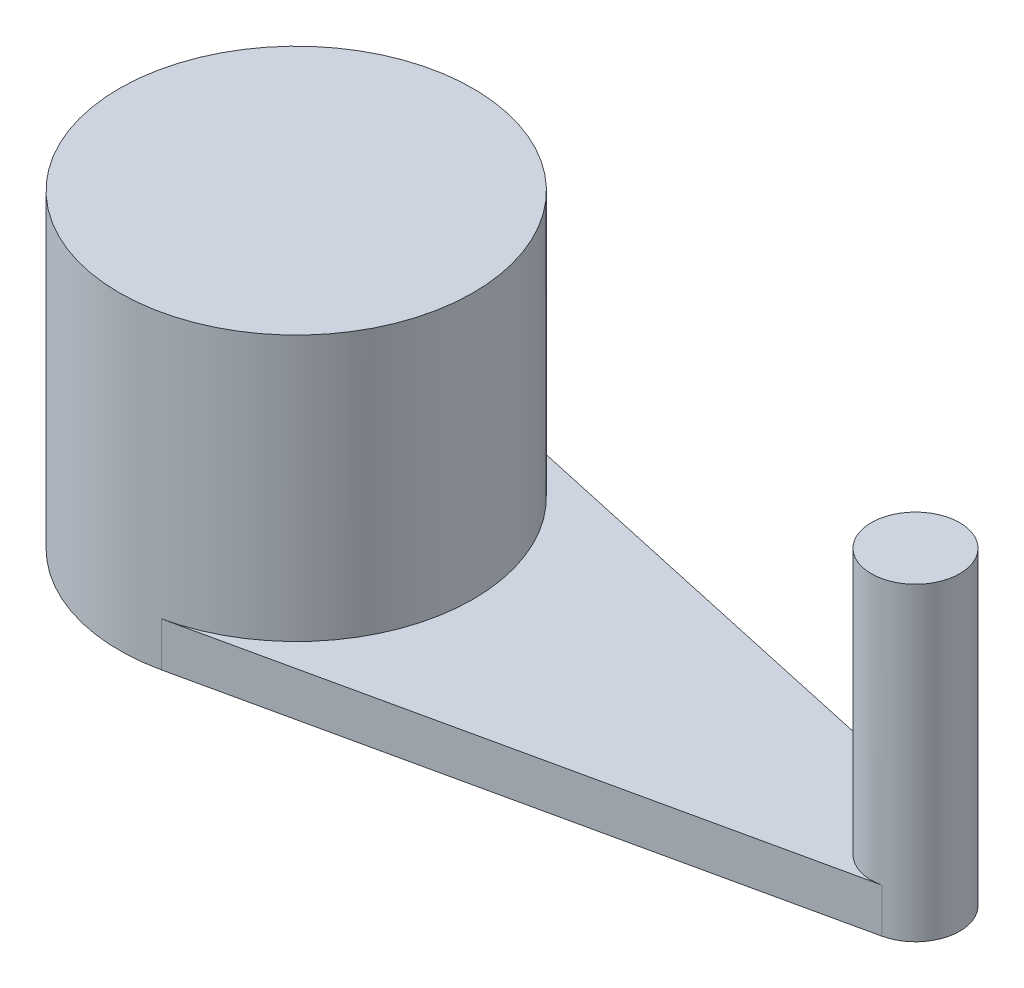
ISO-10303-21;
HEADER;
FILE_DESCRIPTION(('STEP AP214'),'2;1');
FILE_NAME('part.step','',(''),(''),'','','');
FILE_SCHEMA(('AUTOMOTIVE_DESIGN { 1 0 10303 214 1 1 1 1 }'));
ENDSEC;
DATA;
#1=APPLICATION_CONTEXT('core data for automotive mechanical design processes');
#2=APPLICATION_PROTOCOL_DEFINITION('international standard','automotive_design',2000,#1);
#3=PRODUCT_CONTEXT('',#1,'mechanical');
#4=PRODUCT('Part','Part','',(#3));
#5=PRODUCT_RELATED_PRODUCT_CATEGORY('part','',(#4));
#6=PRODUCT_DEFINITION_FORMATION('','',#4);
#7=PRODUCT_DEFINITION_CONTEXT('part definition',#1,'design');
#8=PRODUCT_DEFINITION('design','',#6,#7);
#9=PRODUCT_DEFINITION_SHAPE('','',#8);
#10=(LENGTH_UNIT() NAMED_UNIT(*) SI_UNIT(.MILLI.,.METRE.));
#11=(NAMED_UNIT(*) PLANE_ANGLE_UNIT() SI_UNIT($,.RADIAN.));
#12=(NAMED_UNIT(*) SI_UNIT($,.STERADIAN.) SOLID_ANGLE_UNIT());
#13=UNCERTAINTY_MEASURE_WITH_UNIT(LENGTH_MEASURE(1.E-05),#10,'distance_accuracy_value','');
#14=(GEOMETRIC_REPRESENTATION_CONTEXT(3) GLOBAL_UNCERTAINTY_ASSIGNED_CONTEXT((#13)) GLOBAL_UNIT_ASSIGNED_CONTEXT((#10,
#11,#12)) REPRESENTATION_CONTEXT('',''));
#15=CARTESIAN_POINT('',(0.,0.,0.));
#16=DIRECTION('',(0.,0.,1.));
#17=DIRECTION('',(1.,0.,0.));
#18=AXIS2_PLACEMENT_3D('',#15,#16,#17);
#19=CARTESIAN_POINT('',(4.28571428571428,5.,19.5354204731105));
#20=DIRECTION('',(-0.214285714285714,0.,-0.976771023655525));
#21=DIRECTION('',(-0.976771023655525,0.,0.214285714285714));
#22=AXIS2_PLACEMENT_3D('',#19,#20,#21);
#23=PLANE('',#22);
#24=DIRECTION('',(0.976771023655525,0.,-0.214285714285714));
#25=VECTOR('',#24,1.);
#26=CARTESIAN_POINT('',(4.28571428571428,0.,19.5354204731105));
#27=LINE('',#26,#25);
#28=CARTESIAN_POINT('',(4.28571428571428,0.,19.5354204731105));
#29=VERTEX_POINT('',#28);
#30=CARTESIAN_POINT('',(71.0714285714286,0.,4.88385511827763));
#31=VERTEX_POINT('',#30);
#32=EDGE_CURVE('E102',#29,#31,#27,.T.);
#33=ORIENTED_EDGE('',*,*,#32,.T.);
#34=DIRECTION('',(0.,-1.,0.));
#35=VECTOR('',#34,1.);
#36=CARTESIAN_POINT('',(71.0714285714286,5.,4.88385511827763));
#37=LINE('',#36,#35);
#38=CARTESIAN_POINT('',(71.0714285714286,5.,4.88385511827763));
#39=VERTEX_POINT('',#38);
#40=EDGE_CURVE('E52',#39,#31,#37,.T.);
#41=ORIENTED_EDGE('',*,*,#40,.F.);
#42=DIRECTION('',(0.976771023655525,0.,-0.214285714285714));
#43=VECTOR('',#42,1.);
#44=CARTESIAN_POINT('',(4.28571428571428,5.,19.5354204731105));
#45=LINE('',#44,#43);
#46=CARTESIAN_POINT('',(4.28571428571428,5.,19.5354204731105));
#47=VERTEX_POINT('',#46);
#48=EDGE_CURVE('E95',#47,#39,#45,.T.);
#49=ORIENTED_EDGE('',*,*,#48,.F.);
#50=DIRECTION('',(0.,-1.,0.));
#51=VECTOR('',#50,1.);
#52=CARTESIAN_POINT('',(4.28571428571428,5.,19.5354204731105));
#53=LINE('',#52,#51);
#54=EDGE_CURVE('E89',#47,#29,#53,.T.);
#55=ORIENTED_EDGE('',*,*,#54,.T.);
#56=EDGE_LOOP('',(#33,#41,#49,#55));
#57=FACE_BOUND('',#56,.T.);
#58=ADVANCED_FACE('F49',(#57),#23,.F.);
#59=CARTESIAN_POINT('',(70.,5.,0.));
#60=DIRECTION('',(0.,-1.,0.));
#61=DIRECTION('',(0.,0.,-1.));
#62=AXIS2_PLACEMENT_3D('',#59,#60,#61);
#63=CYLINDRICAL_SURFACE('',#62,5.);
#64=CARTESIAN_POINT('',(70.,0.,0.));
#65=DIRECTION('',(0.,1.,0.));
#66=DIRECTION('',(0.,0.,1.));
#67=AXIS2_PLACEMENT_3D('',#64,#65,#66);
#68=CIRCLE('',#67,5.);
#69=CARTESIAN_POINT('',(71.0714285714286,0.,-4.88385511827763));
#70=VERTEX_POINT('',#69);
#71=EDGE_CURVE('E109',#31,#70,#68,.T.);
#72=ORIENTED_EDGE('',*,*,#71,.T.);
#73=DIRECTION('',(0.,-1.,0.));
#74=VECTOR('',#73,1.);
#75=CARTESIAN_POINT('',(71.0714285714286,5.,-4.88385511827763));
#76=LINE('',#75,#74);
#77=CARTESIAN_POINT('',(71.0714285714286,5.,-4.88385511827763));
#78=VERTEX_POINT('',#77);
#79=EDGE_CURVE('E126',#78,#70,#76,.T.);
#80=ORIENTED_EDGE('',*,*,#79,.F.);
#81=CARTESIAN_POINT('',(70.,5.,0.));
#82=DIRECTION('',(0.,1.,0.));
#83=DIRECTION('',(0.,0.,1.));
#84=AXIS2_PLACEMENT_3D('',#81,#82,#83);
#85=CIRCLE('',#84,5.);
#86=EDGE_CURVE('E11',#78,#39,#85,.T.);
#87=ORIENTED_EDGE('',*,*,#86,.T.);
#88=ORIENTED_EDGE('',*,*,#40,.T.);
#89=EDGE_LOOP('',(#72,#80,#87,#88));
#90=FACE_BOUND('',#89,.T.);
#91=CARTESIAN_POINT('',(70.,35.,0.));
#92=DIRECTION('',(0.,1.,0.));
#93=DIRECTION('',(0.,0.,1.));
#94=AXIS2_PLACEMENT_3D('',#91,#92,#93);
#95=CIRCLE('',#94,5.);
#96=CARTESIAN_POINT('',(70.,35.,5.));
#97=VERTEX_POINT('',#96);
#98=EDGE_CURVE('E140',#97,#97,#95,.T.);
#99=ORIENTED_EDGE('',*,*,#98,.F.);
#100=EDGE_LOOP('',(#99));
#101=FACE_BOUND('',#100,.T.);
#102=ADVANCED_FACE('F131',(#90,#101),#63,.T.);
#103=CARTESIAN_POINT('',(4.28571428571428,5.,-19.5354204731105));
#104=DIRECTION('',(0.214285714285714,0.,-0.976771023655525));
#105=DIRECTION('',(-0.976771023655525,0.,-0.214285714285714));
#106=AXIS2_PLACEMENT_3D('',#103,#104,#105);
#107=PLANE('',#106);
#108=DIRECTION('',(0.976771023655525,0.,0.214285714285714));
#109=VECTOR('',#108,1.);
#110=CARTESIAN_POINT('',(4.28571428571428,0.,-19.5354204731105));
#111=LINE('',#110,#109);
#112=CARTESIAN_POINT('',(4.28571428571428,0.,-19.5354204731105));
#113=VERTEX_POINT('',#112);
#114=EDGE_CURVE('E96',#113,#70,#111,.T.);
#115=ORIENTED_EDGE('',*,*,#114,.F.);
#116=DIRECTION('',(0.,-1.,0.));
#117=VECTOR('',#116,1.);
#118=CARTESIAN_POINT('',(4.28571428571428,5.,-19.5354204731105));
#119=LINE('',#118,#117);
#120=CARTESIAN_POINT('',(4.28571428571428,5.,-19.5354204731105));
#121=VERTEX_POINT('',#120);
#122=EDGE_CURVE('E67',#121,#113,#119,.T.);
#123=ORIENTED_EDGE('',*,*,#122,.F.);
#124=DIRECTION('',(0.976771023655525,0.,0.214285714285714));
#125=VECTOR('',#124,1.);
#126=CARTESIAN_POINT('',(4.28571428571428,5.,-19.5354204731105));
#127=LINE('',#126,#125);
#128=EDGE_CURVE('E105',#121,#78,#127,.T.);
#129=ORIENTED_EDGE('',*,*,#128,.T.);
#130=ORIENTED_EDGE('',*,*,#79,.T.);
#131=EDGE_LOOP('',(#115,#123,#129,#130));
#132=FACE_BOUND('',#131,.T.);
#133=ADVANCED_FACE('F149',(#132),#107,.T.);
#134=CARTESIAN_POINT('',(0.,5.,0.));
#135=DIRECTION('',(0.,-1.,0.));
#136=DIRECTION('',(0.,0.,-1.));
#137=AXIS2_PLACEMENT_3D('',#134,#135,#136);
#138=CYLINDRICAL_SURFACE('',#137,20.);
#139=CARTESIAN_POINT('',(0.,0.,0.));
#140=DIRECTION('',(0.,1.,0.));
#141=DIRECTION('',(0.,0.,1.));
#142=AXIS2_PLACEMENT_3D('',#139,#140,#141);
#143=CIRCLE('',#142,20.);
#144=EDGE_CURVE('E85',#113,#29,#143,.T.);
#145=ORIENTED_EDGE('',*,*,#144,.T.);
#146=ORIENTED_EDGE('',*,*,#54,.F.);
#147=CARTESIAN_POINT('',(0.,5.,0.));
#148=DIRECTION('',(0.,1.,0.));
#149=DIRECTION('',(0.,0.,1.));
#150=AXIS2_PLACEMENT_3D('',#147,#148,#149);
#151=CIRCLE('',#150,20.);
#152=EDGE_CURVE('E118',#47,#121,#151,.T.);
#153=ORIENTED_EDGE('',*,*,#152,.T.);
#154=ORIENTED_EDGE('',*,*,#122,.T.);
#155=EDGE_LOOP('',(#145,#146,#153,#154));
#156=FACE_BOUND('',#155,.T.);
#157=CARTESIAN_POINT('',(0.,35.,0.));
#158=DIRECTION('',(0.,1.,0.));
#159=DIRECTION('',(0.,0.,1.));
#160=AXIS2_PLACEMENT_3D('',#157,#158,#159);
#161=CIRCLE('',#160,20.);
#162=CARTESIAN_POINT('',(0.,35.,20.));
#163=VERTEX_POINT('',#162);
#164=EDGE_CURVE('E112',#163,#163,#161,.T.);
#165=ORIENTED_EDGE('',*,*,#164,.F.);
#166=EDGE_LOOP('',(#165));
#167=FACE_BOUND('',#166,.T.);
#168=ADVANCED_FACE('F87',(#156,#167),#138,.T.);
#169=CARTESIAN_POINT('',(0.,5.,0.));
#170=DIRECTION('',(0.,1.,0.));
#171=DIRECTION('',(0.,0.,1.));
#172=AXIS2_PLACEMENT_3D('',#169,#170,#171);
#173=PLANE('',#172);
#174=ORIENTED_EDGE('',*,*,#152,.F.);
#175=ORIENTED_EDGE('',*,*,#48,.T.);
#176=ORIENTED_EDGE('',*,*,#86,.F.);
#177=ORIENTED_EDGE('',*,*,#128,.F.);
#178=EDGE_LOOP('',(#174,#175,#176,#177));
#179=FACE_BOUND('',#178,.T.);
#180=ADVANCED_FACE('F136',(#179),#173,.T.);
#181=CARTESIAN_POINT('',(0.,0.,0.));
#182=DIRECTION('',(0.,1.,0.));
#183=DIRECTION('',(0.,0.,1.));
#184=AXIS2_PLACEMENT_3D('',#181,#182,#183);
#185=PLANE('',#184);
#186=ORIENTED_EDGE('',*,*,#32,.F.);
#187=ORIENTED_EDGE('',*,*,#144,.F.);
#188=ORIENTED_EDGE('',*,*,#114,.T.);
#189=ORIENTED_EDGE('',*,*,#71,.F.);
#190=EDGE_LOOP('',(#186,#187,#188,#189));
#191=FACE_BOUND('',#190,.T.);
#192=ADVANCED_FACE('F107',(#191),#185,.F.);
#193=CARTESIAN_POINT('',(70.,35.,0.));
#194=DIRECTION('',(0.,1.,0.));
#195=DIRECTION('',(0.,0.,1.));
#196=AXIS2_PLACEMENT_3D('',#193,#194,#195);
#197=PLANE('',#196);
#198=ORIENTED_EDGE('',*,*,#98,.T.);
#199=EDGE_LOOP('',(#198));
#200=FACE_BOUND('',#199,.T.);
#201=ADVANCED_FACE('F147',(#200),#197,.T.);
#202=CARTESIAN_POINT('',(0.,35.,0.));
#203=DIRECTION('',(0.,1.,0.));
#204=DIRECTION('',(0.,0.,1.));
#205=AXIS2_PLACEMENT_3D('',#202,#203,#204);
#206=PLANE('',#205);
#207=ORIENTED_EDGE('',*,*,#164,.T.);
#208=EDGE_LOOP('',(#207));
#209=FACE_BOUND('',#208,.T.);
#210=ADVANCED_FACE('F164',(#209),#206,.T.);
#211=CLOSED_SHELL('',(#58,#102,#133,#168,#180,#192,#201,#210));
#212=MANIFOLD_SOLID_BREP('B2',#211);
#213=ADVANCED_BREP_SHAPE_REPRESENTATION('',(#18,#212),#14);
#214=SHAPE_DEFINITION_REPRESENTATION(#9,#213);
ENDSEC;
END-ISO-10303-21;
